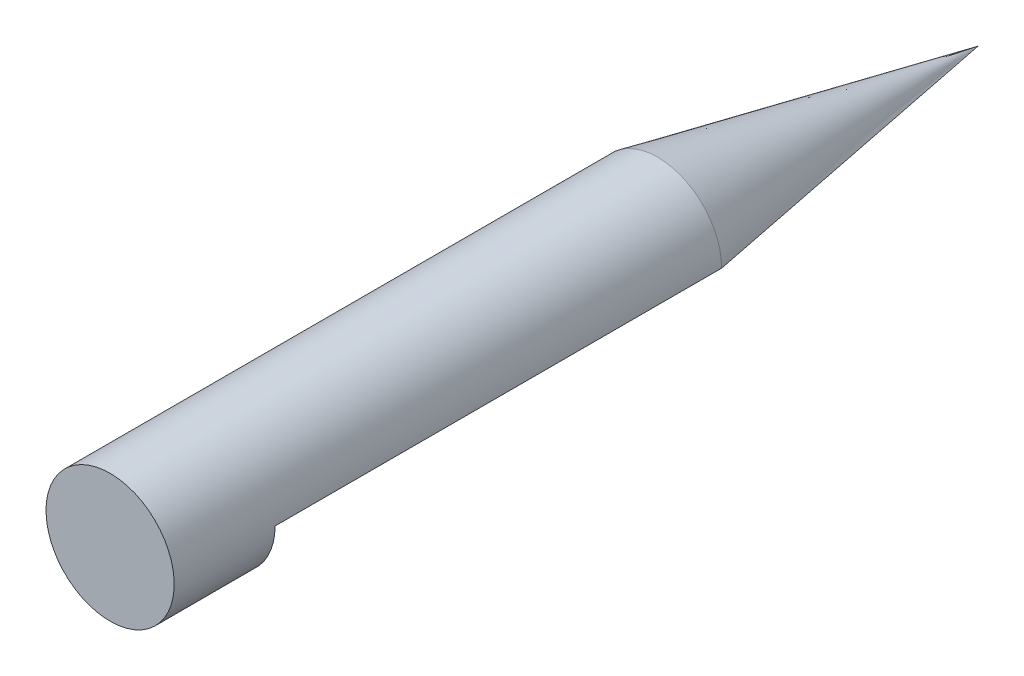
ISO-10303-21;
HEADER;
FILE_DESCRIPTION(('STEP AP214'),'2;1');
FILE_NAME('part.step','',(''),(''),'','','');
FILE_SCHEMA(('AUTOMOTIVE_DESIGN { 1 0 10303 214 1 1 1 1 }'));
ENDSEC;
DATA;
#1=APPLICATION_CONTEXT('core data for automotive mechanical design processes');
#2=APPLICATION_PROTOCOL_DEFINITION('international standard','automotive_design',2000,#1);
#3=PRODUCT_CONTEXT('',#1,'mechanical');
#4=PRODUCT('Part','Part','',(#3));
#5=PRODUCT_RELATED_PRODUCT_CATEGORY('part','',(#4));
#6=PRODUCT_DEFINITION_FORMATION('','',#4);
#7=PRODUCT_DEFINITION_CONTEXT('part definition',#1,'design');
#8=PRODUCT_DEFINITION('design','',#6,#7);
#9=PRODUCT_DEFINITION_SHAPE('','',#8);
#10=(LENGTH_UNIT() NAMED_UNIT(*) SI_UNIT(.MILLI.,.METRE.));
#11=(NAMED_UNIT(*) PLANE_ANGLE_UNIT() SI_UNIT($,.RADIAN.));
#12=(NAMED_UNIT(*) SI_UNIT($,.STERADIAN.) SOLID_ANGLE_UNIT());
#13=UNCERTAINTY_MEASURE_WITH_UNIT(LENGTH_MEASURE(1.E-05),#10,'distance_accuracy_value','');
#14=(GEOMETRIC_REPRESENTATION_CONTEXT(3) GLOBAL_UNCERTAINTY_ASSIGNED_CONTEXT((#13)) GLOBAL_UNIT_ASSIGNED_CONTEXT((#10,
#11,#12)) REPRESENTATION_CONTEXT('',''));
#15=CARTESIAN_POINT('',(0.,0.,0.));
#16=DIRECTION('',(0.,0.,1.));
#17=DIRECTION('',(1.,0.,0.));
#18=AXIS2_PLACEMENT_3D('',#15,#16,#17);
#19=CARTESIAN_POINT('',(0.,0.,-2.));
#20=DIRECTION('',(0.,0.,-1.));
#21=DIRECTION('',(-1.,0.,0.));
#22=AXIS2_PLACEMENT_3D('',#19,#20,#21);
#23=CYLINDRICAL_SURFACE('',#22,3.175);
#24=DIRECTION('',(0.,0.,1.));
#25=VECTOR('',#24,1.);
#26=CARTESIAN_POINT('',(3.175,0.,-47.));
#27=LINE('',#26,#25);
#28=CARTESIAN_POINT('',(3.175,0.,-29.125));
#29=VERTEX_POINT('',#28);
#30=CARTESIAN_POINT('',(3.175,0.,-7.));
#31=VERTEX_POINT('',#30);
#32=EDGE_CURVE('E81',#29,#31,#27,.T.);
#33=ORIENTED_EDGE('',*,*,#32,.F.);
#34=CARTESIAN_POINT('',(0.,0.,-29.125));
#35=DIRECTION('',(0.,0.,-1.));
#36=DIRECTION('',(-1.,0.,0.));
#37=AXIS2_PLACEMENT_3D('',#34,#35,#36);
#38=CIRCLE('',#37,3.175);
#39=CARTESIAN_POINT('',(-3.175,0.,-29.125));
#40=VERTEX_POINT('',#39);
#41=EDGE_CURVE('E97',#40,#29,#38,.T.);
#42=ORIENTED_EDGE('',*,*,#41,.F.);
#43=DIRECTION('',(0.,0.,1.));
#44=VECTOR('',#43,1.);
#45=CARTESIAN_POINT('',(-3.175,0.,-47.));
#46=LINE('',#45,#44);
#47=CARTESIAN_POINT('',(-3.175,0.,-7.));
#48=VERTEX_POINT('',#47);
#49=EDGE_CURVE('E72',#40,#48,#46,.T.);
#50=ORIENTED_EDGE('',*,*,#49,.T.);
#51=CARTESIAN_POINT('',(0.,0.,-7.));
#52=DIRECTION('',(0.,0.,1.));
#53=DIRECTION('',(1.,0.,0.));
#54=AXIS2_PLACEMENT_3D('',#51,#52,#53);
#55=CIRCLE('',#54,3.175);
#56=EDGE_CURVE('E92',#48,#31,#55,.T.);
#57=ORIENTED_EDGE('',*,*,#56,.T.);
#58=EDGE_LOOP('',(#33,#42,#50,#57));
#59=FACE_BOUND('',#58,.T.);
#60=CARTESIAN_POINT('',(0.,0.,-2.));
#61=DIRECTION('',(0.,0.,-1.));
#62=DIRECTION('',(-1.,0.,0.));
#63=AXIS2_PLACEMENT_3D('',#60,#61,#62);
#64=CIRCLE('',#63,3.175);
#65=CARTESIAN_POINT('',(-3.175,0.,-2.));
#66=VERTEX_POINT('',#65);
#67=EDGE_CURVE('E100',#66,#66,#64,.T.);
#68=ORIENTED_EDGE('',*,*,#67,.T.);
#69=EDGE_LOOP('',(#68));
#70=FACE_BOUND('',#69,.T.);
#71=ADVANCED_FACE('F55',(#59,#70),#23,.T.);
#72=CARTESIAN_POINT('',(3.175,0.,-2.));
#73=DIRECTION('',(0.,0.,1.));
#74=DIRECTION('',(1.,0.,0.));
#75=AXIS2_PLACEMENT_3D('',#72,#73,#74);
#76=PLANE('',#75);
#77=ORIENTED_EDGE('',*,*,#67,.F.);
#78=EDGE_LOOP('',(#77));
#79=FACE_BOUND('',#78,.T.);
#80=ADVANCED_FACE('F104',(#79),#76,.T.);
#81=CARTESIAN_POINT('',(0.,0.,-45.));
#82=DIRECTION('',(0.,0.,1.));
#83=DIRECTION('',(1.,0.,0.));
#84=AXIS2_PLACEMENT_3D('',#81,#82,#83);
#85=CONICAL_SURFACE('',#84,0.,0.197395559849881);
#86=DIRECTION('',(-0.196116135138184,0.,0.98058067569092));
#87=VECTOR('',#86,1.);
#88=CARTESIAN_POINT('',(0.,0.,-45.));
#89=LINE('',#88,#87);
#90=CARTESIAN_POINT('',(0.,0.,-45.));
#91=VERTEX_POINT('',#90);
#92=EDGE_CURVE('E13',#40,#91,#89,.F.);
#93=ORIENTED_EDGE('',*,*,#92,.F.);
#94=ORIENTED_EDGE('',*,*,#41,.T.);
#95=DIRECTION('',(-0.196116135138184,0.,-0.98058067569092));
#96=VECTOR('',#95,1.);
#97=CARTESIAN_POINT('',(0.,0.,-45.));
#98=LINE('',#97,#96);
#99=EDGE_CURVE('E62',#91,#29,#98,.F.);
#100=ORIENTED_EDGE('',*,*,#99,.F.);
#101=EDGE_LOOP('',(#93,#94,#100));
#102=FACE_BOUND('',#101,.T.);
#103=ADVANCED_FACE('F106',(#102),#85,.T.);
#104=CARTESIAN_POINT('',(3.175,0.,-47.));
#105=DIRECTION('',(0.,1.,0.));
#106=DIRECTION('',(0.,0.,1.));
#107=AXIS2_PLACEMENT_3D('',#104,#105,#106);
#108=PLANE('',#107);
#109=ORIENTED_EDGE('',*,*,#92,.T.);
#110=ORIENTED_EDGE('',*,*,#99,.T.);
#111=ORIENTED_EDGE('',*,*,#32,.T.);
#112=DIRECTION('',(-1.,0.,0.));
#113=VECTOR('',#112,1.);
#114=CARTESIAN_POINT('',(3.175,0.,-7.));
#115=LINE('',#114,#113);
#116=EDGE_CURVE('E84',#31,#48,#115,.T.);
#117=ORIENTED_EDGE('',*,*,#116,.T.);
#118=ORIENTED_EDGE('',*,*,#49,.F.);
#119=EDGE_LOOP('',(#109,#110,#111,#117,#118));
#120=FACE_BOUND('',#119,.T.);
#121=ADVANCED_FACE('F83',(#120),#108,.F.);
#122=CARTESIAN_POINT('',(0.,0.,-7.));
#123=DIRECTION('',(0.,0.,1.));
#124=DIRECTION('',(1.,0.,0.));
#125=AXIS2_PLACEMENT_3D('',#122,#123,#124);
#126=PLANE('',#125);
#127=ORIENTED_EDGE('',*,*,#56,.F.);
#128=ORIENTED_EDGE('',*,*,#116,.F.);
#129=EDGE_LOOP('',(#127,#128));
#130=FACE_BOUND('',#129,.T.);
#131=ADVANCED_FACE('F91',(#130),#126,.F.);
#132=CLOSED_SHELL('',(#71,#80,#103,#121,#131));
#133=MANIFOLD_SOLID_BREP('B2',#132);
#134=ADVANCED_BREP_SHAPE_REPRESENTATION('',(#18,#133),#14);
#135=SHAPE_DEFINITION_REPRESENTATION(#9,#134);
ENDSEC;
END-ISO-10303-21;
